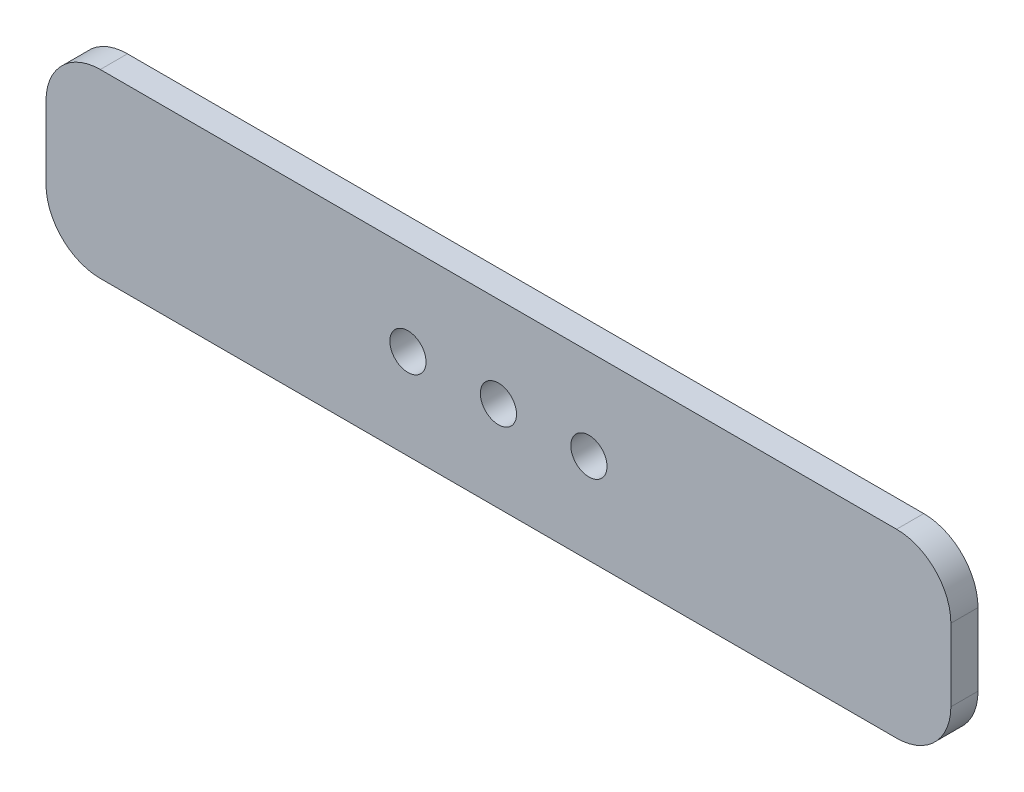
ISO-10303-21;
HEADER;
FILE_DESCRIPTION(('STEP AP214'),'2;1');
FILE_NAME('part.step','',(''),(''),'','','');
FILE_SCHEMA(('AUTOMOTIVE_DESIGN { 1 0 10303 214 1 1 1 1 }'));
ENDSEC;
DATA;
#1=APPLICATION_CONTEXT('core data for automotive mechanical design processes');
#2=APPLICATION_PROTOCOL_DEFINITION('international standard','automotive_design',2000,#1);
#3=PRODUCT_CONTEXT('',#1,'mechanical');
#4=PRODUCT('Part','Part','',(#3));
#5=PRODUCT_RELATED_PRODUCT_CATEGORY('part','',(#4));
#6=PRODUCT_DEFINITION_FORMATION('','',#4);
#7=PRODUCT_DEFINITION_CONTEXT('part definition',#1,'design');
#8=PRODUCT_DEFINITION('design','',#6,#7);
#9=PRODUCT_DEFINITION_SHAPE('','',#8);
#10=(LENGTH_UNIT() NAMED_UNIT(*) SI_UNIT(.MILLI.,.METRE.));
#11=(NAMED_UNIT(*) PLANE_ANGLE_UNIT() SI_UNIT($,.RADIAN.));
#12=(NAMED_UNIT(*) SI_UNIT($,.STERADIAN.) SOLID_ANGLE_UNIT());
#13=UNCERTAINTY_MEASURE_WITH_UNIT(LENGTH_MEASURE(1.E-05),#10,'distance_accuracy_value','');
#14=(GEOMETRIC_REPRESENTATION_CONTEXT(3) GLOBAL_UNCERTAINTY_ASSIGNED_CONTEXT((#13)) GLOBAL_UNIT_ASSIGNED_CONTEXT((#10,
#11,#12)) REPRESENTATION_CONTEXT('',''));
#15=CARTESIAN_POINT('',(0.,0.,0.));
#16=DIRECTION('',(0.,0.,1.));
#17=DIRECTION('',(1.,0.,0.));
#18=AXIS2_PLACEMENT_3D('',#15,#16,#17);
#19=CARTESIAN_POINT('',(470.,30.,15.));
#20=DIRECTION('',(0.,0.,-1.));
#21=DIRECTION('',(-1.,0.,0.));
#22=AXIS2_PLACEMENT_3D('',#19,#20,#21);
#23=CYLINDRICAL_SURFACE('',#22,30.);
#24=CARTESIAN_POINT('',(470.,30.,0.));
#25=DIRECTION('',(0.,0.,1.));
#26=DIRECTION('',(1.,0.,0.));
#27=AXIS2_PLACEMENT_3D('',#24,#25,#26);
#28=CIRCLE('',#27,30.);
#29=CARTESIAN_POINT('',(470.,0.,0.));
#30=VERTEX_POINT('',#29);
#31=CARTESIAN_POINT('',(500.,30.0000000000002,0.));
#32=VERTEX_POINT('',#31);
#33=EDGE_CURVE('E128',#30,#32,#28,.T.);
#34=ORIENTED_EDGE('',*,*,#33,.T.);
#35=DIRECTION('',(0.,0.,-1.));
#36=VECTOR('',#35,1.);
#37=CARTESIAN_POINT('',(500.,30.0000000000002,15.));
#38=LINE('',#37,#36);
#39=CARTESIAN_POINT('',(500.,30.0000000000002,15.));
#40=VERTEX_POINT('',#39);
#41=EDGE_CURVE('E11',#40,#32,#38,.T.);
#42=ORIENTED_EDGE('',*,*,#41,.F.);
#43=CARTESIAN_POINT('',(470.,30.,15.));
#44=DIRECTION('',(0.,0.,1.));
#45=DIRECTION('',(1.,0.,0.));
#46=AXIS2_PLACEMENT_3D('',#43,#44,#45);
#47=CIRCLE('',#46,30.);
#48=CARTESIAN_POINT('',(470.,0.,15.));
#49=VERTEX_POINT('',#48);
#50=EDGE_CURVE('E143',#49,#40,#47,.T.);
#51=ORIENTED_EDGE('',*,*,#50,.F.);
#52=DIRECTION('',(0.,0.,-1.));
#53=VECTOR('',#52,1.);
#54=CARTESIAN_POINT('',(470.,0.,15.));
#55=LINE('',#54,#53);
#56=EDGE_CURVE('E124',#49,#30,#55,.T.);
#57=ORIENTED_EDGE('',*,*,#56,.T.);
#58=EDGE_LOOP('',(#34,#42,#51,#57));
#59=FACE_BOUND('',#58,.T.);
#60=ADVANCED_FACE('F32',(#59),#23,.T.);
#61=CARTESIAN_POINT('',(500.,30.0000000000002,15.));
#62=DIRECTION('',(-1.,0.,0.));
#63=DIRECTION('',(0.,0.,1.));
#64=AXIS2_PLACEMENT_3D('',#61,#62,#63);
#65=PLANE('',#64);
#66=DIRECTION('',(0.,1.,0.));
#67=VECTOR('',#66,1.);
#68=CARTESIAN_POINT('',(500.,30.0000000000002,0.));
#69=LINE('',#68,#67);
#70=CARTESIAN_POINT('',(500.,70.,0.));
#71=VERTEX_POINT('',#70);
#72=EDGE_CURVE('E131',#32,#71,#69,.T.);
#73=ORIENTED_EDGE('',*,*,#72,.T.);
#74=DIRECTION('',(0.,0.,-1.));
#75=VECTOR('',#74,1.);
#76=CARTESIAN_POINT('',(500.,70.,15.));
#77=LINE('',#76,#75);
#78=CARTESIAN_POINT('',(500.,70.,15.));
#79=VERTEX_POINT('',#78);
#80=EDGE_CURVE('E40',#79,#71,#77,.T.);
#81=ORIENTED_EDGE('',*,*,#80,.F.);
#82=DIRECTION('',(0.,1.,0.));
#83=VECTOR('',#82,1.);
#84=CARTESIAN_POINT('',(500.,30.0000000000002,15.));
#85=LINE('',#84,#83);
#86=EDGE_CURVE('E91',#40,#79,#85,.T.);
#87=ORIENTED_EDGE('',*,*,#86,.F.);
#88=ORIENTED_EDGE('',*,*,#41,.T.);
#89=EDGE_LOOP('',(#73,#81,#87,#88));
#90=FACE_BOUND('',#89,.T.);
#91=ADVANCED_FACE('F237',(#90),#65,.F.);
#92=CARTESIAN_POINT('',(470.,70.,15.));
#93=DIRECTION('',(0.,0.,-1.));
#94=DIRECTION('',(-1.,0.,0.));
#95=AXIS2_PLACEMENT_3D('',#92,#93,#94);
#96=CYLINDRICAL_SURFACE('',#95,30.);
#97=CARTESIAN_POINT('',(470.,70.,0.));
#98=DIRECTION('',(0.,0.,1.));
#99=DIRECTION('',(1.,0.,0.));
#100=AXIS2_PLACEMENT_3D('',#97,#98,#99);
#101=CIRCLE('',#100,30.);
#102=CARTESIAN_POINT('',(470.,100.,0.));
#103=VERTEX_POINT('',#102);
#104=EDGE_CURVE('E134',#71,#103,#101,.T.);
#105=ORIENTED_EDGE('',*,*,#104,.T.);
#106=DIRECTION('',(0.,0.,-1.));
#107=VECTOR('',#106,1.);
#108=CARTESIAN_POINT('',(470.,100.,15.));
#109=LINE('',#108,#107);
#110=CARTESIAN_POINT('',(470.,100.,15.));
#111=VERTEX_POINT('',#110);
#112=EDGE_CURVE('E150',#111,#103,#109,.T.);
#113=ORIENTED_EDGE('',*,*,#112,.F.);
#114=CARTESIAN_POINT('',(470.,70.,15.));
#115=DIRECTION('',(0.,0.,1.));
#116=DIRECTION('',(1.,0.,0.));
#117=AXIS2_PLACEMENT_3D('',#114,#115,#116);
#118=CIRCLE('',#117,30.);
#119=EDGE_CURVE('E158',#79,#111,#118,.T.);
#120=ORIENTED_EDGE('',*,*,#119,.F.);
#121=ORIENTED_EDGE('',*,*,#80,.T.);
#122=EDGE_LOOP('',(#105,#113,#120,#121));
#123=FACE_BOUND('',#122,.T.);
#124=ADVANCED_FACE('F156',(#123),#96,.T.);
#125=CARTESIAN_POINT('',(30.,100.,15.));
#126=DIRECTION('',(0.,-1.,0.));
#127=DIRECTION('',(0.,0.,-1.));
#128=AXIS2_PLACEMENT_3D('',#125,#126,#127);
#129=PLANE('',#128);
#130=DIRECTION('',(-1.,0.,0.));
#131=VECTOR('',#130,1.);
#132=CARTESIAN_POINT('',(30.,100.,0.));
#133=LINE('',#132,#131);
#134=CARTESIAN_POINT('',(30.,100.,0.));
#135=VERTEX_POINT('',#134);
#136=EDGE_CURVE('E136',#103,#135,#133,.T.);
#137=ORIENTED_EDGE('',*,*,#136,.T.);
#138=DIRECTION('',(0.,0.,-1.));
#139=VECTOR('',#138,1.);
#140=CARTESIAN_POINT('',(30.,100.,15.));
#141=LINE('',#140,#139);
#142=CARTESIAN_POINT('',(30.,100.,15.));
#143=VERTEX_POINT('',#142);
#144=EDGE_CURVE('E147',#143,#135,#141,.T.);
#145=ORIENTED_EDGE('',*,*,#144,.F.);
#146=DIRECTION('',(-1.,0.,0.));
#147=VECTOR('',#146,1.);
#148=CARTESIAN_POINT('',(30.,100.,15.));
#149=LINE('',#148,#147);
#150=EDGE_CURVE('E170',#111,#143,#149,.T.);
#151=ORIENTED_EDGE('',*,*,#150,.F.);
#152=ORIENTED_EDGE('',*,*,#112,.T.);
#153=EDGE_LOOP('',(#137,#145,#151,#152));
#154=FACE_BOUND('',#153,.T.);
#155=ADVANCED_FACE('F166',(#154),#129,.F.);
#156=CARTESIAN_POINT('',(30.,70.,15.));
#157=DIRECTION('',(0.,0.,-1.));
#158=DIRECTION('',(-1.,0.,0.));
#159=AXIS2_PLACEMENT_3D('',#156,#157,#158);
#160=CYLINDRICAL_SURFACE('',#159,30.);
#161=CARTESIAN_POINT('',(30.,70.,0.));
#162=DIRECTION('',(0.,0.,1.));
#163=DIRECTION('',(-1.,0.,0.));
#164=AXIS2_PLACEMENT_3D('',#161,#162,#163);
#165=CIRCLE('',#164,30.);
#166=CARTESIAN_POINT('',(0.,70.,0.));
#167=VERTEX_POINT('',#166);
#168=EDGE_CURVE('E138',#135,#167,#165,.T.);
#169=ORIENTED_EDGE('',*,*,#168,.T.);
#170=DIRECTION('',(0.,0.,-1.));
#171=VECTOR('',#170,1.);
#172=CARTESIAN_POINT('',(0.,70.,15.));
#173=LINE('',#172,#171);
#174=CARTESIAN_POINT('',(0.,70.,15.));
#175=VERTEX_POINT('',#174);
#176=EDGE_CURVE('E119',#175,#167,#173,.T.);
#177=ORIENTED_EDGE('',*,*,#176,.F.);
#178=CARTESIAN_POINT('',(30.,70.,15.));
#179=DIRECTION('',(0.,0.,1.));
#180=DIRECTION('',(-1.,0.,0.));
#181=AXIS2_PLACEMENT_3D('',#178,#179,#180);
#182=CIRCLE('',#181,30.);
#183=EDGE_CURVE('E110',#143,#175,#182,.T.);
#184=ORIENTED_EDGE('',*,*,#183,.F.);
#185=ORIENTED_EDGE('',*,*,#144,.T.);
#186=EDGE_LOOP('',(#169,#177,#184,#185));
#187=FACE_BOUND('',#186,.T.);
#188=ADVANCED_FACE('F169',(#187),#160,.T.);
#189=CARTESIAN_POINT('',(0.,30.0000000000002,15.));
#190=DIRECTION('',(1.,0.,0.));
#191=DIRECTION('',(0.,0.,-1.));
#192=AXIS2_PLACEMENT_3D('',#189,#190,#191);
#193=PLANE('',#192);
#194=DIRECTION('',(0.,-1.,0.));
#195=VECTOR('',#194,1.);
#196=CARTESIAN_POINT('',(0.,30.0000000000002,0.));
#197=LINE('',#196,#195);
#198=CARTESIAN_POINT('',(0.,30.,0.));
#199=VERTEX_POINT('',#198);
#200=EDGE_CURVE('E118',#167,#199,#197,.T.);
#201=ORIENTED_EDGE('',*,*,#200,.T.);
#202=DIRECTION('',(0.,0.,-1.));
#203=VECTOR('',#202,1.);
#204=CARTESIAN_POINT('',(0.,30.,15.));
#205=LINE('',#204,#203);
#206=CARTESIAN_POINT('',(0.,30.,15.));
#207=VERTEX_POINT('',#206);
#208=EDGE_CURVE('E115',#207,#199,#205,.T.);
#209=ORIENTED_EDGE('',*,*,#208,.F.);
#210=DIRECTION('',(0.,-1.,0.));
#211=VECTOR('',#210,1.);
#212=CARTESIAN_POINT('',(0.,30.0000000000002,15.));
#213=LINE('',#212,#211);
#214=EDGE_CURVE('E104',#175,#207,#213,.T.);
#215=ORIENTED_EDGE('',*,*,#214,.F.);
#216=ORIENTED_EDGE('',*,*,#176,.T.);
#217=EDGE_LOOP('',(#201,#209,#215,#216));
#218=FACE_BOUND('',#217,.T.);
#219=ADVANCED_FACE('F116',(#218),#193,.F.);
#220=CARTESIAN_POINT('',(30.,30.,15.));
#221=DIRECTION('',(0.,0.,-1.));
#222=DIRECTION('',(-1.,0.,0.));
#223=AXIS2_PLACEMENT_3D('',#220,#221,#222);
#224=CYLINDRICAL_SURFACE('',#223,30.);
#225=CARTESIAN_POINT('',(30.,30.,0.));
#226=DIRECTION('',(0.,0.,1.));
#227=DIRECTION('',(-1.,0.,0.));
#228=AXIS2_PLACEMENT_3D('',#225,#226,#227);
#229=CIRCLE('',#228,30.);
#230=CARTESIAN_POINT('',(30.0000000000002,0.,0.));
#231=VERTEX_POINT('',#230);
#232=EDGE_CURVE('E77',#199,#231,#229,.T.);
#233=ORIENTED_EDGE('',*,*,#232,.T.);
#234=DIRECTION('',(0.,0.,-1.));
#235=VECTOR('',#234,1.);
#236=CARTESIAN_POINT('',(30.0000000000002,0.,15.));
#237=LINE('',#236,#235);
#238=CARTESIAN_POINT('',(30.0000000000002,0.,15.));
#239=VERTEX_POINT('',#238);
#240=EDGE_CURVE('E120',#239,#231,#237,.T.);
#241=ORIENTED_EDGE('',*,*,#240,.F.);
#242=CARTESIAN_POINT('',(30.,30.,15.));
#243=DIRECTION('',(0.,0.,1.));
#244=DIRECTION('',(-1.,0.,0.));
#245=AXIS2_PLACEMENT_3D('',#242,#243,#244);
#246=CIRCLE('',#245,30.);
#247=EDGE_CURVE('E108',#207,#239,#246,.T.);
#248=ORIENTED_EDGE('',*,*,#247,.F.);
#249=ORIENTED_EDGE('',*,*,#208,.T.);
#250=EDGE_LOOP('',(#233,#241,#248,#249));
#251=FACE_BOUND('',#250,.T.);
#252=ADVANCED_FACE('F122',(#251),#224,.T.);
#253=CARTESIAN_POINT('',(30.0000000000002,0.,15.));
#254=DIRECTION('',(0.,1.,0.));
#255=DIRECTION('',(0.,0.,1.));
#256=AXIS2_PLACEMENT_3D('',#253,#254,#255);
#257=PLANE('',#256);
#258=CARTESIAN_POINT('',(60.0000000000002,0.,7.5));
#259=DIRECTION('',(0.,-1.,0.));
#260=DIRECTION('',(0.,0.,-1.));
#261=AXIS2_PLACEMENT_3D('',#258,#259,#260);
#262=CIRCLE('',#261,3.00000000000001);
#263=CARTESIAN_POINT('',(60.0000000000002,0.,4.49999999999999));
#264=VERTEX_POINT('',#263);
#265=EDGE_CURVE('E200',#264,#264,#262,.T.);
#266=ORIENTED_EDGE('',*,*,#265,.F.);
#267=EDGE_LOOP('',(#266));
#268=FACE_BOUND('',#267,.T.);
#269=CARTESIAN_POINT('',(440.,0.,7.5));
#270=DIRECTION('',(0.,-1.,0.));
#271=DIRECTION('',(0.,0.,-1.));
#272=AXIS2_PLACEMENT_3D('',#269,#270,#271);
#273=CIRCLE('',#272,2.99999999999999);
#274=CARTESIAN_POINT('',(440.,0.,4.50000000000001));
#275=VERTEX_POINT('',#274);
#276=EDGE_CURVE('E194',#275,#275,#273,.T.);
#277=ORIENTED_EDGE('',*,*,#276,.F.);
#278=EDGE_LOOP('',(#277));
#279=FACE_BOUND('',#278,.T.);
#280=DIRECTION('',(1.,0.,0.));
#281=VECTOR('',#280,1.);
#282=CARTESIAN_POINT('',(30.0000000000002,0.,0.));
#283=LINE('',#282,#281);
#284=EDGE_CURVE('E83',#231,#30,#283,.T.);
#285=ORIENTED_EDGE('',*,*,#284,.T.);
#286=ORIENTED_EDGE('',*,*,#56,.F.);
#287=DIRECTION('',(1.,0.,0.));
#288=VECTOR('',#287,1.);
#289=CARTESIAN_POINT('',(30.0000000000002,0.,15.));
#290=LINE('',#289,#288);
#291=EDGE_CURVE('E48',#239,#49,#290,.T.);
#292=ORIENTED_EDGE('',*,*,#291,.F.);
#293=ORIENTED_EDGE('',*,*,#240,.T.);
#294=EDGE_LOOP('',(#285,#286,#292,#293));
#295=FACE_BOUND('',#294,.T.);
#296=ADVANCED_FACE('F215',(#268,#279,#295),#257,.F.);
#297=CARTESIAN_POINT('',(470.,30.,15.));
#298=DIRECTION('',(0.,0.,1.));
#299=DIRECTION('',(1.,0.,0.));
#300=AXIS2_PLACEMENT_3D('',#297,#298,#299);
#301=PLANE('',#300);
#302=CARTESIAN_POINT('',(200.,50.,15.));
#303=DIRECTION('',(0.,0.,1.));
#304=DIRECTION('',(1.,0.,0.));
#305=AXIS2_PLACEMENT_3D('',#302,#303,#304);
#306=CIRCLE('',#305,10.);
#307=CARTESIAN_POINT('',(210.,50.,15.));
#308=VERTEX_POINT('',#307);
#309=EDGE_CURVE('E189',#308,#308,#306,.T.);
#310=ORIENTED_EDGE('',*,*,#309,.F.);
#311=EDGE_LOOP('',(#310));
#312=FACE_BOUND('',#311,.T.);
#313=CARTESIAN_POINT('',(250.,50.,15.));
#314=DIRECTION('',(0.,0.,1.));
#315=DIRECTION('',(1.,0.,0.));
#316=AXIS2_PLACEMENT_3D('',#313,#314,#315);
#317=CIRCLE('',#316,9.99999999999998);
#318=CARTESIAN_POINT('',(260.,50.,15.));
#319=VERTEX_POINT('',#318);
#320=EDGE_CURVE('E183',#319,#319,#317,.T.);
#321=ORIENTED_EDGE('',*,*,#320,.F.);
#322=EDGE_LOOP('',(#321));
#323=FACE_BOUND('',#322,.T.);
#324=CARTESIAN_POINT('',(300.,50.,15.));
#325=DIRECTION('',(0.,0.,1.));
#326=DIRECTION('',(1.,0.,0.));
#327=AXIS2_PLACEMENT_3D('',#324,#325,#326);
#328=CIRCLE('',#327,9.99999999999998);
#329=CARTESIAN_POINT('',(310.,50.,15.));
#330=VERTEX_POINT('',#329);
#331=EDGE_CURVE('E176',#330,#330,#328,.T.);
#332=ORIENTED_EDGE('',*,*,#331,.F.);
#333=EDGE_LOOP('',(#332));
#334=FACE_BOUND('',#333,.T.);
#335=ORIENTED_EDGE('',*,*,#50,.T.);
#336=ORIENTED_EDGE('',*,*,#86,.T.);
#337=ORIENTED_EDGE('',*,*,#119,.T.);
#338=ORIENTED_EDGE('',*,*,#150,.T.);
#339=ORIENTED_EDGE('',*,*,#183,.T.);
#340=ORIENTED_EDGE('',*,*,#214,.T.);
#341=ORIENTED_EDGE('',*,*,#247,.T.);
#342=ORIENTED_EDGE('',*,*,#291,.T.);
#343=EDGE_LOOP('',(#335,#336,#337,#338,#339,#340,#341,#342));
#344=FACE_BOUND('',#343,.T.);
#345=ADVANCED_FACE('F106',(#312,#323,#334,#344),#301,.T.);
#346=CARTESIAN_POINT('',(470.,30.,0.));
#347=DIRECTION('',(0.,0.,1.));
#348=DIRECTION('',(1.,0.,0.));
#349=AXIS2_PLACEMENT_3D('',#346,#347,#348);
#350=PLANE('',#349);
#351=CARTESIAN_POINT('',(200.,50.,0.));
#352=DIRECTION('',(0.,0.,1.));
#353=DIRECTION('',(1.,0.,0.));
#354=AXIS2_PLACEMENT_3D('',#351,#352,#353);
#355=CIRCLE('',#354,10.);
#356=CARTESIAN_POINT('',(210.,50.,0.));
#357=VERTEX_POINT('',#356);
#358=EDGE_CURVE('E132',#357,#357,#355,.T.);
#359=ORIENTED_EDGE('',*,*,#358,.T.);
#360=EDGE_LOOP('',(#359));
#361=FACE_BOUND('',#360,.T.);
#362=CARTESIAN_POINT('',(250.,50.,0.));
#363=DIRECTION('',(0.,0.,1.));
#364=DIRECTION('',(1.,0.,0.));
#365=AXIS2_PLACEMENT_3D('',#362,#363,#364);
#366=CIRCLE('',#365,9.99999999999998);
#367=CARTESIAN_POINT('',(260.,50.,0.));
#368=VERTEX_POINT('',#367);
#369=EDGE_CURVE('E186',#368,#368,#366,.T.);
#370=ORIENTED_EDGE('',*,*,#369,.T.);
#371=EDGE_LOOP('',(#370));
#372=FACE_BOUND('',#371,.T.);
#373=CARTESIAN_POINT('',(300.,50.,0.));
#374=DIRECTION('',(0.,0.,1.));
#375=DIRECTION('',(1.,0.,0.));
#376=AXIS2_PLACEMENT_3D('',#373,#374,#375);
#377=CIRCLE('',#376,9.99999999999998);
#378=CARTESIAN_POINT('',(310.,50.,0.));
#379=VERTEX_POINT('',#378);
#380=EDGE_CURVE('E179',#379,#379,#377,.T.);
#381=ORIENTED_EDGE('',*,*,#380,.T.);
#382=EDGE_LOOP('',(#381));
#383=FACE_BOUND('',#382,.T.);
#384=ORIENTED_EDGE('',*,*,#33,.F.);
#385=ORIENTED_EDGE('',*,*,#284,.F.);
#386=ORIENTED_EDGE('',*,*,#232,.F.);
#387=ORIENTED_EDGE('',*,*,#200,.F.);
#388=ORIENTED_EDGE('',*,*,#168,.F.);
#389=ORIENTED_EDGE('',*,*,#136,.F.);
#390=ORIENTED_EDGE('',*,*,#104,.F.);
#391=ORIENTED_EDGE('',*,*,#72,.F.);
#392=EDGE_LOOP('',(#384,#385,#386,#387,#388,#389,#390,#391));
#393=FACE_BOUND('',#392,.T.);
#394=ADVANCED_FACE('F162',(#361,#372,#383,#393),#350,.F.);
#395=CARTESIAN_POINT('',(300.,50.,0.));
#396=DIRECTION('',(0.,0.,1.));
#397=DIRECTION('',(1.,0.,0.));
#398=AXIS2_PLACEMENT_3D('',#395,#396,#397);
#399=CYLINDRICAL_SURFACE('',#398,9.99999999999998);
#400=ORIENTED_EDGE('',*,*,#380,.F.);
#401=EDGE_LOOP('',(#400));
#402=FACE_BOUND('',#401,.T.);
#403=ORIENTED_EDGE('',*,*,#331,.T.);
#404=EDGE_LOOP('',(#403));
#405=FACE_BOUND('',#404,.T.);
#406=ADVANCED_FACE('F259',(#402,#405),#399,.F.);
#407=CARTESIAN_POINT('',(250.,50.,0.));
#408=DIRECTION('',(0.,0.,1.));
#409=DIRECTION('',(1.,0.,0.));
#410=AXIS2_PLACEMENT_3D('',#407,#408,#409);
#411=CYLINDRICAL_SURFACE('',#410,9.99999999999998);
#412=ORIENTED_EDGE('',*,*,#369,.F.);
#413=EDGE_LOOP('',(#412));
#414=FACE_BOUND('',#413,.T.);
#415=ORIENTED_EDGE('',*,*,#320,.T.);
#416=EDGE_LOOP('',(#415));
#417=FACE_BOUND('',#416,.T.);
#418=ADVANCED_FACE('F232',(#414,#417),#411,.F.);
#419=CARTESIAN_POINT('',(200.,50.,0.));
#420=DIRECTION('',(0.,0.,1.));
#421=DIRECTION('',(1.,0.,0.));
#422=AXIS2_PLACEMENT_3D('',#419,#420,#421);
#423=CYLINDRICAL_SURFACE('',#422,10.);
#424=ORIENTED_EDGE('',*,*,#358,.F.);
#425=EDGE_LOOP('',(#424));
#426=FACE_BOUND('',#425,.T.);
#427=ORIENTED_EDGE('',*,*,#309,.T.);
#428=EDGE_LOOP('',(#427));
#429=FACE_BOUND('',#428,.T.);
#430=ADVANCED_FACE('F223',(#426,#429),#423,.F.);
#431=CARTESIAN_POINT('',(440.,20.,7.5));
#432=DIRECTION('',(0.,-1.,0.));
#433=DIRECTION('',(0.,0.,-1.));
#434=AXIS2_PLACEMENT_3D('',#431,#432,#433);
#435=CYLINDRICAL_SURFACE('',#434,2.99999999999999);
#436=CARTESIAN_POINT('',(440.,20.,7.5));
#437=DIRECTION('',(0.,-1.,0.));
#438=DIRECTION('',(0.,0.,-1.));
#439=AXIS2_PLACEMENT_3D('',#436,#437,#438);
#440=CIRCLE('',#439,2.99999999999999);
#441=CARTESIAN_POINT('',(440.,20.,4.50000000000001));
#442=VERTEX_POINT('',#441);
#443=EDGE_CURVE('E197',#442,#442,#440,.T.);
#444=ORIENTED_EDGE('',*,*,#443,.F.);
#445=EDGE_LOOP('',(#444));
#446=FACE_BOUND('',#445,.T.);
#447=ORIENTED_EDGE('',*,*,#276,.T.);
#448=EDGE_LOOP('',(#447));
#449=FACE_BOUND('',#448,.T.);
#450=ADVANCED_FACE('F221',(#446,#449),#435,.F.);
#451=CARTESIAN_POINT('',(440.,20.,7.5));
#452=DIRECTION('',(0.,-1.,0.));
#453=DIRECTION('',(0.,0.,-1.));
#454=AXIS2_PLACEMENT_3D('',#451,#452,#453);
#455=PLANE('',#454);
#456=ORIENTED_EDGE('',*,*,#443,.T.);
#457=EDGE_LOOP('',(#456));
#458=FACE_BOUND('',#457,.T.);
#459=ADVANCED_FACE('F211',(#458),#455,.T.);
#460=CARTESIAN_POINT('',(60.0000000000002,20.,7.5));
#461=DIRECTION('',(0.,-1.,0.));
#462=DIRECTION('',(0.,0.,-1.));
#463=AXIS2_PLACEMENT_3D('',#460,#461,#462);
#464=CYLINDRICAL_SURFACE('',#463,3.00000000000001);
#465=CARTESIAN_POINT('',(60.0000000000002,20.,7.5));
#466=DIRECTION('',(0.,-1.,0.));
#467=DIRECTION('',(0.,0.,-1.));
#468=AXIS2_PLACEMENT_3D('',#465,#466,#467);
#469=CIRCLE('',#468,3.00000000000001);
#470=CARTESIAN_POINT('',(60.0000000000002,20.,4.49999999999999));
#471=VERTEX_POINT('',#470);
#472=EDGE_CURVE('E180',#471,#471,#469,.T.);
#473=ORIENTED_EDGE('',*,*,#472,.F.);
#474=EDGE_LOOP('',(#473));
#475=FACE_BOUND('',#474,.T.);
#476=ORIENTED_EDGE('',*,*,#265,.T.);
#477=EDGE_LOOP('',(#476));
#478=FACE_BOUND('',#477,.T.);
#479=ADVANCED_FACE('F208',(#475,#478),#464,.F.);
#480=CARTESIAN_POINT('',(60.0000000000002,20.,7.5));
#481=DIRECTION('',(0.,-1.,0.));
#482=DIRECTION('',(0.,0.,-1.));
#483=AXIS2_PLACEMENT_3D('',#480,#481,#482);
#484=PLANE('',#483);
#485=ORIENTED_EDGE('',*,*,#472,.T.);
#486=EDGE_LOOP('',(#485));
#487=FACE_BOUND('',#486,.T.);
#488=ADVANCED_FACE('F206',(#487),#484,.T.);
#489=CLOSED_SHELL('',(#60,#91,#124,#155,#188,#219,#252,#296,#345,#394,#406,#418,#430,#450,#459,
#479,#488));
#490=MANIFOLD_SOLID_BREP('B2',#489);
#491=ADVANCED_BREP_SHAPE_REPRESENTATION('',(#18,#490),#14);
#492=SHAPE_DEFINITION_REPRESENTATION(#9,#491);
ENDSEC;
END-ISO-10303-21;
